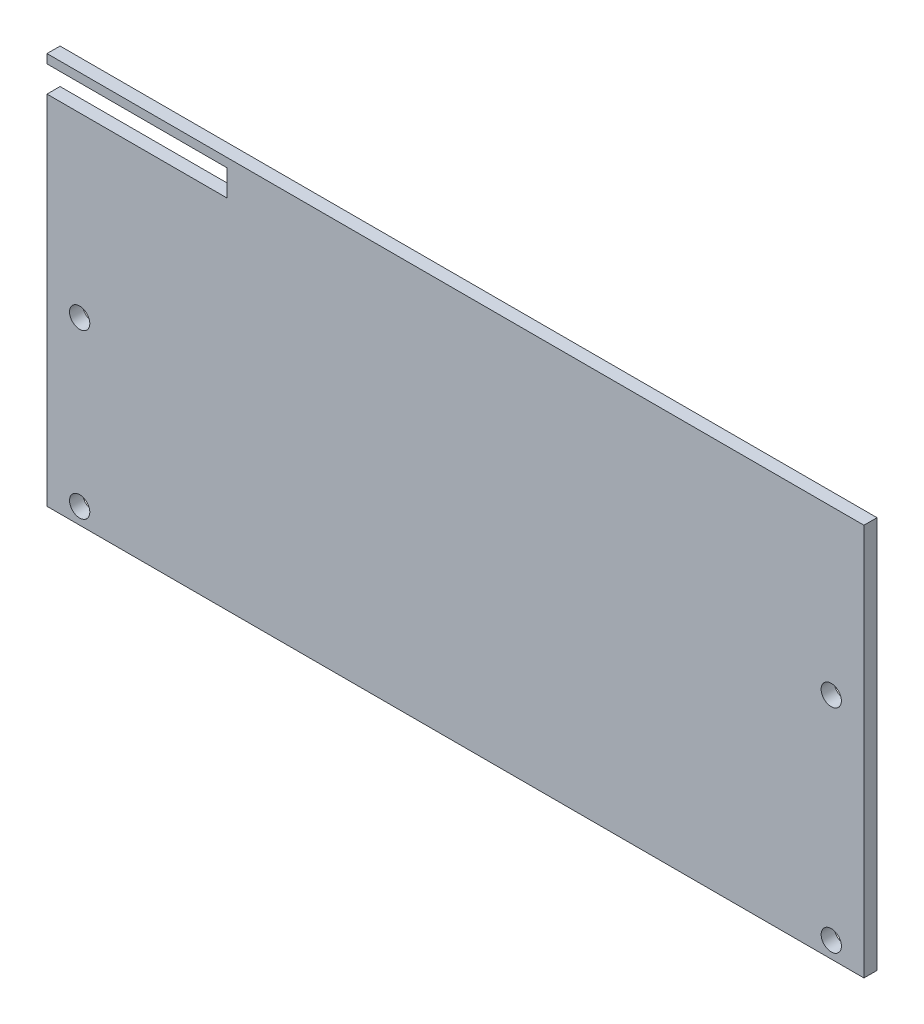
ISO-10303-21;
HEADER;
FILE_DESCRIPTION(('STEP AP214'),'2;1');
FILE_NAME('part.step','',(''),(''),'','','');
FILE_SCHEMA(('AUTOMOTIVE_DESIGN { 1 0 10303 214 1 1 1 1 }'));
ENDSEC;
DATA;
#1=APPLICATION_CONTEXT('core data for automotive mechanical design processes');
#2=APPLICATION_PROTOCOL_DEFINITION('international standard','automotive_design',2000,#1);
#3=PRODUCT_CONTEXT('',#1,'mechanical');
#4=PRODUCT('Part','Part','',(#3));
#5=PRODUCT_RELATED_PRODUCT_CATEGORY('part','',(#4));
#6=PRODUCT_DEFINITION_FORMATION('','',#4);
#7=PRODUCT_DEFINITION_CONTEXT('part definition',#1,'design');
#8=PRODUCT_DEFINITION('design','',#6,#7);
#9=PRODUCT_DEFINITION_SHAPE('','',#8);
#10=(LENGTH_UNIT() NAMED_UNIT(*) SI_UNIT(.MILLI.,.METRE.));
#11=(NAMED_UNIT(*) PLANE_ANGLE_UNIT() SI_UNIT($,.RADIAN.));
#12=(NAMED_UNIT(*) SI_UNIT($,.STERADIAN.) SOLID_ANGLE_UNIT());
#13=UNCERTAINTY_MEASURE_WITH_UNIT(LENGTH_MEASURE(1.E-05),#10,'distance_accuracy_value','');
#14=(GEOMETRIC_REPRESENTATION_CONTEXT(3) GLOBAL_UNCERTAINTY_ASSIGNED_CONTEXT((#13)) GLOBAL_UNIT_ASSIGNED_CONTEXT((#10,
#11,#12)) REPRESENTATION_CONTEXT('',''));
#15=CARTESIAN_POINT('',(0.,0.,0.));
#16=DIRECTION('',(0.,0.,1.));
#17=DIRECTION('',(1.,0.,0.));
#18=AXIS2_PLACEMENT_3D('',#15,#16,#17);
#19=CARTESIAN_POINT('',(0.,0.,4.));
#20=DIRECTION('',(1.,0.,0.));
#21=DIRECTION('',(0.,1.,0.));
#22=AXIS2_PLACEMENT_3D('',#19,#20,#21);
#23=PLANE('',#22);
#24=DIRECTION('',(0.,-1.,0.));
#25=VECTOR('',#24,1.);
#26=CARTESIAN_POINT('',(0.,0.,0.));
#27=LINE('',#26,#25);
#28=CARTESIAN_POINT('',(0.,0.,0.));
#29=VERTEX_POINT('',#28);
#30=CARTESIAN_POINT('',(0.,-2.74076718130609,0.));
#31=VERTEX_POINT('',#30);
#32=EDGE_CURVE('E174',#29,#31,#27,.T.);
#33=ORIENTED_EDGE('',*,*,#32,.T.);
#34=DIRECTION('',(0.,0.,1.));
#35=VECTOR('',#34,1.);
#36=CARTESIAN_POINT('',(0.,-2.74076718130609,0.));
#37=LINE('',#36,#35);
#38=CARTESIAN_POINT('',(0.,-2.74076718130609,4.));
#39=VERTEX_POINT('',#38);
#40=EDGE_CURVE('E137',#31,#39,#37,.T.);
#41=ORIENTED_EDGE('',*,*,#40,.T.);
#42=DIRECTION('',(0.,-1.,0.));
#43=VECTOR('',#42,1.);
#44=CARTESIAN_POINT('',(0.,0.,4.));
#45=LINE('',#44,#43);
#46=CARTESIAN_POINT('',(0.,0.,4.));
#47=VERTEX_POINT('',#46);
#48=EDGE_CURVE('E166',#47,#39,#45,.T.);
#49=ORIENTED_EDGE('',*,*,#48,.F.);
#50=DIRECTION('',(0.,0.,-1.));
#51=VECTOR('',#50,1.);
#52=CARTESIAN_POINT('',(0.,0.,4.));
#53=LINE('',#52,#51);
#54=EDGE_CURVE('E173',#47,#29,#53,.T.);
#55=ORIENTED_EDGE('',*,*,#54,.T.);
#56=EDGE_LOOP('',(#33,#41,#49,#55));
#57=FACE_BOUND('',#56,.T.);
#58=ADVANCED_FACE('F33',(#57),#23,.F.);
#59=CARTESIAN_POINT('',(0.,0.,4.));
#60=DIRECTION('',(0.,0.,1.));
#61=DIRECTION('',(1.,0.,0.));
#62=AXIS2_PLACEMENT_3D('',#59,#60,#61);
#63=PLANE('',#62);
#64=DIRECTION('',(-1.,0.,0.));
#65=VECTOR('',#64,1.);
#66=CARTESIAN_POINT('',(0.,-2.74076718130609,4.));
#67=LINE('',#66,#65);
#68=CARTESIAN_POINT('',(55.1514587355655,-2.74076718130609,4.));
#69=VERTEX_POINT('',#68);
#70=EDGE_CURVE('E129',#69,#39,#67,.T.);
#71=ORIENTED_EDGE('',*,*,#70,.F.);
#72=DIRECTION('',(0.,1.,0.));
#73=VECTOR('',#72,1.);
#74=CARTESIAN_POINT('',(55.1514587355655,-2.74076718130609,4.));
#75=LINE('',#74,#73);
#76=CARTESIAN_POINT('',(55.1514587355655,-10.740767181306,4.));
#77=VERTEX_POINT('',#76);
#78=EDGE_CURVE('E131',#77,#69,#75,.T.);
#79=ORIENTED_EDGE('',*,*,#78,.F.);
#80=DIRECTION('',(1.,0.,0.));
#81=VECTOR('',#80,1.);
#82=CARTESIAN_POINT('',(0.,-10.740767181306,4.));
#83=LINE('',#82,#81);
#84=CARTESIAN_POINT('',(0.,-10.740767181306,4.));
#85=VERTEX_POINT('',#84);
#86=EDGE_CURVE('E109',#85,#77,#83,.T.);
#87=ORIENTED_EDGE('',*,*,#86,.F.);
#88=CARTESIAN_POINT('',(0.,-120.,4.));
#89=VERTEX_POINT('',#88);
#90=EDGE_CURVE('E85',#85,#89,#45,.T.);
#91=ORIENTED_EDGE('',*,*,#90,.T.);
#92=DIRECTION('',(1.,0.,0.));
#93=VECTOR('',#92,1.);
#94=CARTESIAN_POINT('',(0.,-120.,4.));
#95=LINE('',#94,#93);
#96=CARTESIAN_POINT('',(250.,-120.,4.));
#97=VERTEX_POINT('',#96);
#98=EDGE_CURVE('E168',#89,#97,#95,.T.);
#99=ORIENTED_EDGE('',*,*,#98,.T.);
#100=DIRECTION('',(0.,1.,0.));
#101=VECTOR('',#100,1.);
#102=CARTESIAN_POINT('',(250.,0.,4.));
#103=LINE('',#102,#101);
#104=CARTESIAN_POINT('',(250.,0.,4.));
#105=VERTEX_POINT('',#104);
#106=EDGE_CURVE('E170',#97,#105,#103,.T.);
#107=ORIENTED_EDGE('',*,*,#106,.T.);
#108=DIRECTION('',(-1.,0.,0.));
#109=VECTOR('',#108,1.);
#110=CARTESIAN_POINT('',(0.,0.,4.));
#111=LINE('',#110,#109);
#112=EDGE_CURVE('E57',#105,#47,#111,.T.);
#113=ORIENTED_EDGE('',*,*,#112,.T.);
#114=ORIENTED_EDGE('',*,*,#48,.T.);
#115=EDGE_LOOP('',(#71,#79,#87,#91,#99,#107,#113,#114));
#116=FACE_BOUND('',#115,.T.);
#117=CARTESIAN_POINT('',(240.,-115.,4.));
#118=DIRECTION('',(0.,0.,1.));
#119=DIRECTION('',(1.,0.,0.));
#120=AXIS2_PLACEMENT_3D('',#117,#118,#119);
#121=CIRCLE('',#120,3.09999999999999);
#122=CARTESIAN_POINT('',(243.1,-115.,4.));
#123=VERTEX_POINT('',#122);
#124=EDGE_CURVE('E149',#123,#123,#121,.T.);
#125=ORIENTED_EDGE('',*,*,#124,.F.);
#126=EDGE_LOOP('',(#125));
#127=FACE_BOUND('',#126,.T.);
#128=CARTESIAN_POINT('',(10.,-115.,4.));
#129=DIRECTION('',(0.,0.,1.));
#130=DIRECTION('',(1.,0.,0.));
#131=AXIS2_PLACEMENT_3D('',#128,#129,#130);
#132=CIRCLE('',#131,3.10000000000001);
#133=CARTESIAN_POINT('',(13.1,-115.,4.));
#134=VERTEX_POINT('',#133);
#135=EDGE_CURVE('E161',#134,#134,#132,.T.);
#136=ORIENTED_EDGE('',*,*,#135,.F.);
#137=EDGE_LOOP('',(#136));
#138=FACE_BOUND('',#137,.T.);
#139=CARTESIAN_POINT('',(10.,-65.,4.));
#140=DIRECTION('',(0.,0.,1.));
#141=DIRECTION('',(1.,0.,0.));
#142=AXIS2_PLACEMENT_3D('',#139,#140,#141);
#143=CIRCLE('',#142,3.1);
#144=CARTESIAN_POINT('',(13.1,-65.,4.));
#145=VERTEX_POINT('',#144);
#146=EDGE_CURVE('E155',#145,#145,#143,.T.);
#147=ORIENTED_EDGE('',*,*,#146,.F.);
#148=EDGE_LOOP('',(#147));
#149=FACE_BOUND('',#148,.T.);
#150=CARTESIAN_POINT('',(240.,-50.,4.));
#151=DIRECTION('',(0.,0.,1.));
#152=DIRECTION('',(1.,0.,0.));
#153=AXIS2_PLACEMENT_3D('',#150,#151,#152);
#154=CIRCLE('',#153,3.09999999999999);
#155=CARTESIAN_POINT('',(243.1,-50.,4.));
#156=VERTEX_POINT('',#155);
#157=EDGE_CURVE('E143',#156,#156,#154,.T.);
#158=ORIENTED_EDGE('',*,*,#157,.F.);
#159=EDGE_LOOP('',(#158));
#160=FACE_BOUND('',#159,.T.);
#161=ADVANCED_FACE('F210',(#116,#127,#138,#149,#160),#63,.T.);
#162=CARTESIAN_POINT('',(0.,0.,0.));
#163=DIRECTION('',(0.,0.,1.));
#164=DIRECTION('',(1.,0.,0.));
#165=AXIS2_PLACEMENT_3D('',#162,#163,#164);
#166=PLANE('',#165);
#167=DIRECTION('',(0.,1.,0.));
#168=VECTOR('',#167,1.);
#169=CARTESIAN_POINT('',(55.1514587355655,-2.74076718130609,0.));
#170=LINE('',#169,#168);
#171=CARTESIAN_POINT('',(55.1514587355655,-10.740767181306,0.));
#172=VERTEX_POINT('',#171);
#173=CARTESIAN_POINT('',(55.1514587355655,-2.74076718130609,0.));
#174=VERTEX_POINT('',#173);
#175=EDGE_CURVE('E117',#172,#174,#170,.T.);
#176=ORIENTED_EDGE('',*,*,#175,.T.);
#177=DIRECTION('',(-1.,0.,0.));
#178=VECTOR('',#177,1.);
#179=CARTESIAN_POINT('',(0.,-2.74076718130609,0.));
#180=LINE('',#179,#178);
#181=EDGE_CURVE('E122',#174,#31,#180,.T.);
#182=ORIENTED_EDGE('',*,*,#181,.T.);
#183=ORIENTED_EDGE('',*,*,#32,.F.);
#184=DIRECTION('',(-1.,0.,0.));
#185=VECTOR('',#184,1.);
#186=CARTESIAN_POINT('',(0.,0.,0.));
#187=LINE('',#186,#185);
#188=CARTESIAN_POINT('',(250.,0.,0.));
#189=VERTEX_POINT('',#188);
#190=EDGE_CURVE('E78',#189,#29,#187,.T.);
#191=ORIENTED_EDGE('',*,*,#190,.F.);
#192=DIRECTION('',(0.,1.,0.));
#193=VECTOR('',#192,1.);
#194=CARTESIAN_POINT('',(250.,0.,0.));
#195=LINE('',#194,#193);
#196=CARTESIAN_POINT('',(250.,-120.,0.));
#197=VERTEX_POINT('',#196);
#198=EDGE_CURVE('E179',#197,#189,#195,.T.);
#199=ORIENTED_EDGE('',*,*,#198,.F.);
#200=DIRECTION('',(1.,0.,0.));
#201=VECTOR('',#200,1.);
#202=CARTESIAN_POINT('',(0.,-120.,0.));
#203=LINE('',#202,#201);
#204=CARTESIAN_POINT('',(0.,-120.,0.));
#205=VERTEX_POINT('',#204);
#206=EDGE_CURVE('E177',#205,#197,#203,.T.);
#207=ORIENTED_EDGE('',*,*,#206,.F.);
#208=CARTESIAN_POINT('',(0.,-10.740767181306,0.));
#209=VERTEX_POINT('',#208);
#210=EDGE_CURVE('E128',#209,#205,#27,.T.);
#211=ORIENTED_EDGE('',*,*,#210,.F.);
#212=DIRECTION('',(1.,0.,0.));
#213=VECTOR('',#212,1.);
#214=CARTESIAN_POINT('',(0.,-10.740767181306,0.));
#215=LINE('',#214,#213);
#216=EDGE_CURVE('E48',#209,#172,#215,.T.);
#217=ORIENTED_EDGE('',*,*,#216,.T.);
#218=EDGE_LOOP('',(#176,#182,#183,#191,#199,#207,#211,#217));
#219=FACE_BOUND('',#218,.T.);
#220=CARTESIAN_POINT('',(10.,-115.,0.));
#221=DIRECTION('',(0.,0.,1.));
#222=DIRECTION('',(1.,0.,0.));
#223=AXIS2_PLACEMENT_3D('',#220,#221,#222);
#224=CIRCLE('',#223,3.10000000000001);
#225=CARTESIAN_POINT('',(13.1,-115.,0.));
#226=VERTEX_POINT('',#225);
#227=EDGE_CURVE('E158',#226,#226,#224,.T.);
#228=ORIENTED_EDGE('',*,*,#227,.T.);
#229=EDGE_LOOP('',(#228));
#230=FACE_BOUND('',#229,.T.);
#231=CARTESIAN_POINT('',(10.,-65.,0.));
#232=DIRECTION('',(0.,0.,1.));
#233=DIRECTION('',(1.,0.,0.));
#234=AXIS2_PLACEMENT_3D('',#231,#232,#233);
#235=CIRCLE('',#234,3.1);
#236=CARTESIAN_POINT('',(13.1,-65.,0.));
#237=VERTEX_POINT('',#236);
#238=EDGE_CURVE('E152',#237,#237,#235,.T.);
#239=ORIENTED_EDGE('',*,*,#238,.T.);
#240=EDGE_LOOP('',(#239));
#241=FACE_BOUND('',#240,.T.);
#242=CARTESIAN_POINT('',(240.,-115.,0.));
#243=DIRECTION('',(0.,0.,1.));
#244=DIRECTION('',(1.,0.,0.));
#245=AXIS2_PLACEMENT_3D('',#242,#243,#244);
#246=CIRCLE('',#245,3.09999999999999);
#247=CARTESIAN_POINT('',(243.1,-115.,0.));
#248=VERTEX_POINT('',#247);
#249=EDGE_CURVE('E146',#248,#248,#246,.T.);
#250=ORIENTED_EDGE('',*,*,#249,.T.);
#251=EDGE_LOOP('',(#250));
#252=FACE_BOUND('',#251,.T.);
#253=CARTESIAN_POINT('',(240.,-50.,0.));
#254=DIRECTION('',(0.,0.,1.));
#255=DIRECTION('',(1.,0.,0.));
#256=AXIS2_PLACEMENT_3D('',#253,#254,#255);
#257=CIRCLE('',#256,3.09999999999999);
#258=CARTESIAN_POINT('',(243.1,-50.,0.));
#259=VERTEX_POINT('',#258);
#260=EDGE_CURVE('E140',#259,#259,#257,.T.);
#261=ORIENTED_EDGE('',*,*,#260,.T.);
#262=EDGE_LOOP('',(#261));
#263=FACE_BOUND('',#262,.T.);
#264=ADVANCED_FACE('F125',(#219,#230,#241,#252,#263),#166,.F.);
#265=ORIENTED_EDGE('',*,*,#90,.F.);
#266=DIRECTION('',(0.,0.,1.));
#267=VECTOR('',#266,1.);
#268=CARTESIAN_POINT('',(0.,-10.740767181306,0.));
#269=LINE('',#268,#267);
#270=EDGE_CURVE('E114',#209,#85,#269,.T.);
#271=ORIENTED_EDGE('',*,*,#270,.F.);
#272=ORIENTED_EDGE('',*,*,#210,.T.);
#273=DIRECTION('',(0.,0.,-1.));
#274=VECTOR('',#273,1.);
#275=CARTESIAN_POINT('',(0.,-120.,4.));
#276=LINE('',#275,#274);
#277=EDGE_CURVE('E11',#89,#205,#276,.T.);
#278=ORIENTED_EDGE('',*,*,#277,.F.);
#279=EDGE_LOOP('',(#265,#271,#272,#278));
#280=FACE_BOUND('',#279,.T.);
#281=ADVANCED_FACE('F35',(#280),#23,.F.);
#282=CARTESIAN_POINT('',(0.,-120.,4.));
#283=DIRECTION('',(0.,1.,0.));
#284=DIRECTION('',(0.,0.,1.));
#285=AXIS2_PLACEMENT_3D('',#282,#283,#284);
#286=PLANE('',#285);
#287=ORIENTED_EDGE('',*,*,#206,.T.);
#288=DIRECTION('',(0.,0.,-1.));
#289=VECTOR('',#288,1.);
#290=CARTESIAN_POINT('',(250.,-120.,4.));
#291=LINE('',#290,#289);
#292=EDGE_CURVE('E41',#97,#197,#291,.T.);
#293=ORIENTED_EDGE('',*,*,#292,.F.);
#294=ORIENTED_EDGE('',*,*,#98,.F.);
#295=ORIENTED_EDGE('',*,*,#277,.T.);
#296=EDGE_LOOP('',(#287,#293,#294,#295));
#297=FACE_BOUND('',#296,.T.);
#298=ADVANCED_FACE('F206',(#297),#286,.F.);
#299=CARTESIAN_POINT('',(250.,0.,4.));
#300=DIRECTION('',(-1.,0.,0.));
#301=DIRECTION('',(0.,-1.,0.));
#302=AXIS2_PLACEMENT_3D('',#299,#300,#301);
#303=PLANE('',#302);
#304=ORIENTED_EDGE('',*,*,#198,.T.);
#305=DIRECTION('',(0.,0.,-1.));
#306=VECTOR('',#305,1.);
#307=CARTESIAN_POINT('',(250.,0.,4.));
#308=LINE('',#307,#306);
#309=EDGE_CURVE('E183',#105,#189,#308,.T.);
#310=ORIENTED_EDGE('',*,*,#309,.F.);
#311=ORIENTED_EDGE('',*,*,#106,.F.);
#312=ORIENTED_EDGE('',*,*,#292,.T.);
#313=EDGE_LOOP('',(#304,#310,#311,#312));
#314=FACE_BOUND('',#313,.T.);
#315=ADVANCED_FACE('F189',(#314),#303,.F.);
#316=CARTESIAN_POINT('',(0.,0.,4.));
#317=DIRECTION('',(0.,-1.,0.));
#318=DIRECTION('',(0.,0.,-1.));
#319=AXIS2_PLACEMENT_3D('',#316,#317,#318);
#320=PLANE('',#319);
#321=ORIENTED_EDGE('',*,*,#190,.T.);
#322=ORIENTED_EDGE('',*,*,#54,.F.);
#323=ORIENTED_EDGE('',*,*,#112,.F.);
#324=ORIENTED_EDGE('',*,*,#309,.T.);
#325=EDGE_LOOP('',(#321,#322,#323,#324));
#326=FACE_BOUND('',#325,.T.);
#327=ADVANCED_FACE('F195',(#326),#320,.F.);
#328=CARTESIAN_POINT('',(10.,-115.,4.));
#329=DIRECTION('',(0.,0.,-1.));
#330=DIRECTION('',(-1.,0.,0.));
#331=AXIS2_PLACEMENT_3D('',#328,#329,#330);
#332=CYLINDRICAL_SURFACE('',#331,3.10000000000001);
#333=ORIENTED_EDGE('',*,*,#135,.T.);
#334=EDGE_LOOP('',(#333));
#335=FACE_BOUND('',#334,.T.);
#336=ORIENTED_EDGE('',*,*,#227,.F.);
#337=EDGE_LOOP('',(#336));
#338=FACE_BOUND('',#337,.T.);
#339=ADVANCED_FACE('F197',(#335,#338),#332,.F.);
#340=CARTESIAN_POINT('',(10.,-65.,4.));
#341=DIRECTION('',(0.,0.,-1.));
#342=DIRECTION('',(-1.,0.,0.));
#343=AXIS2_PLACEMENT_3D('',#340,#341,#342);
#344=CYLINDRICAL_SURFACE('',#343,3.1);
#345=ORIENTED_EDGE('',*,*,#146,.T.);
#346=EDGE_LOOP('',(#345));
#347=FACE_BOUND('',#346,.T.);
#348=ORIENTED_EDGE('',*,*,#238,.F.);
#349=EDGE_LOOP('',(#348));
#350=FACE_BOUND('',#349,.T.);
#351=ADVANCED_FACE('F203',(#347,#350),#344,.F.);
#352=CARTESIAN_POINT('',(240.,-115.,4.));
#353=DIRECTION('',(0.,0.,-1.));
#354=DIRECTION('',(-1.,0.,0.));
#355=AXIS2_PLACEMENT_3D('',#352,#353,#354);
#356=CYLINDRICAL_SURFACE('',#355,3.09999999999999);
#357=ORIENTED_EDGE('',*,*,#124,.T.);
#358=EDGE_LOOP('',(#357));
#359=FACE_BOUND('',#358,.T.);
#360=ORIENTED_EDGE('',*,*,#249,.F.);
#361=EDGE_LOOP('',(#360));
#362=FACE_BOUND('',#361,.T.);
#363=ADVANCED_FACE('F236',(#359,#362),#356,.F.);
#364=CARTESIAN_POINT('',(240.,-50.,4.));
#365=DIRECTION('',(0.,0.,-1.));
#366=DIRECTION('',(-1.,0.,0.));
#367=AXIS2_PLACEMENT_3D('',#364,#365,#366);
#368=CYLINDRICAL_SURFACE('',#367,3.09999999999999);
#369=ORIENTED_EDGE('',*,*,#157,.T.);
#370=EDGE_LOOP('',(#369));
#371=FACE_BOUND('',#370,.T.);
#372=ORIENTED_EDGE('',*,*,#260,.F.);
#373=EDGE_LOOP('',(#372));
#374=FACE_BOUND('',#373,.T.);
#375=ADVANCED_FACE('F232',(#371,#374),#368,.F.);
#376=CARTESIAN_POINT('',(0.,-2.74076718130609,0.));
#377=DIRECTION('',(0.,1.,0.));
#378=DIRECTION('',(0.,0.,1.));
#379=AXIS2_PLACEMENT_3D('',#376,#377,#378);
#380=PLANE('',#379);
#381=ORIENTED_EDGE('',*,*,#70,.T.);
#382=ORIENTED_EDGE('',*,*,#40,.F.);
#383=ORIENTED_EDGE('',*,*,#181,.F.);
#384=DIRECTION('',(0.,0.,1.));
#385=VECTOR('',#384,1.);
#386=CARTESIAN_POINT('',(55.1514587355655,-2.74076718130609,0.));
#387=LINE('',#386,#385);
#388=EDGE_CURVE('E113',#174,#69,#387,.T.);
#389=ORIENTED_EDGE('',*,*,#388,.T.);
#390=EDGE_LOOP('',(#381,#382,#383,#389));
#391=FACE_BOUND('',#390,.T.);
#392=ADVANCED_FACE('F235',(#391),#380,.F.);
#393=CARTESIAN_POINT('',(55.1514587355655,-2.74076718130609,0.));
#394=DIRECTION('',(1.,0.,0.));
#395=DIRECTION('',(0.,0.,-1.));
#396=AXIS2_PLACEMENT_3D('',#393,#394,#395);
#397=PLANE('',#396);
#398=ORIENTED_EDGE('',*,*,#78,.T.);
#399=ORIENTED_EDGE('',*,*,#388,.F.);
#400=ORIENTED_EDGE('',*,*,#175,.F.);
#401=DIRECTION('',(0.,0.,1.));
#402=VECTOR('',#401,1.);
#403=CARTESIAN_POINT('',(55.1514587355655,-10.740767181306,0.));
#404=LINE('',#403,#402);
#405=EDGE_CURVE('E106',#172,#77,#404,.T.);
#406=ORIENTED_EDGE('',*,*,#405,.T.);
#407=EDGE_LOOP('',(#398,#399,#400,#406));
#408=FACE_BOUND('',#407,.T.);
#409=ADVANCED_FACE('F118',(#408),#397,.F.);
#410=CARTESIAN_POINT('',(0.,-10.740767181306,0.));
#411=DIRECTION('',(0.,-1.,0.));
#412=DIRECTION('',(0.,0.,-1.));
#413=AXIS2_PLACEMENT_3D('',#410,#411,#412);
#414=PLANE('',#413);
#415=ORIENTED_EDGE('',*,*,#86,.T.);
#416=ORIENTED_EDGE('',*,*,#405,.F.);
#417=ORIENTED_EDGE('',*,*,#216,.F.);
#418=ORIENTED_EDGE('',*,*,#270,.T.);
#419=EDGE_LOOP('',(#415,#416,#417,#418));
#420=FACE_BOUND('',#419,.T.);
#421=ADVANCED_FACE('F108',(#420),#414,.F.);
#422=CLOSED_SHELL('',(#58,#161,#264,#281,#298,#315,#327,#339,#351,#363,#375,#392,#409,#421));
#423=MANIFOLD_SOLID_BREP('B2',#422);
#424=ADVANCED_BREP_SHAPE_REPRESENTATION('',(#18,#423),#14);
#425=SHAPE_DEFINITION_REPRESENTATION(#9,#424);
ENDSEC;
END-ISO-10303-21;
